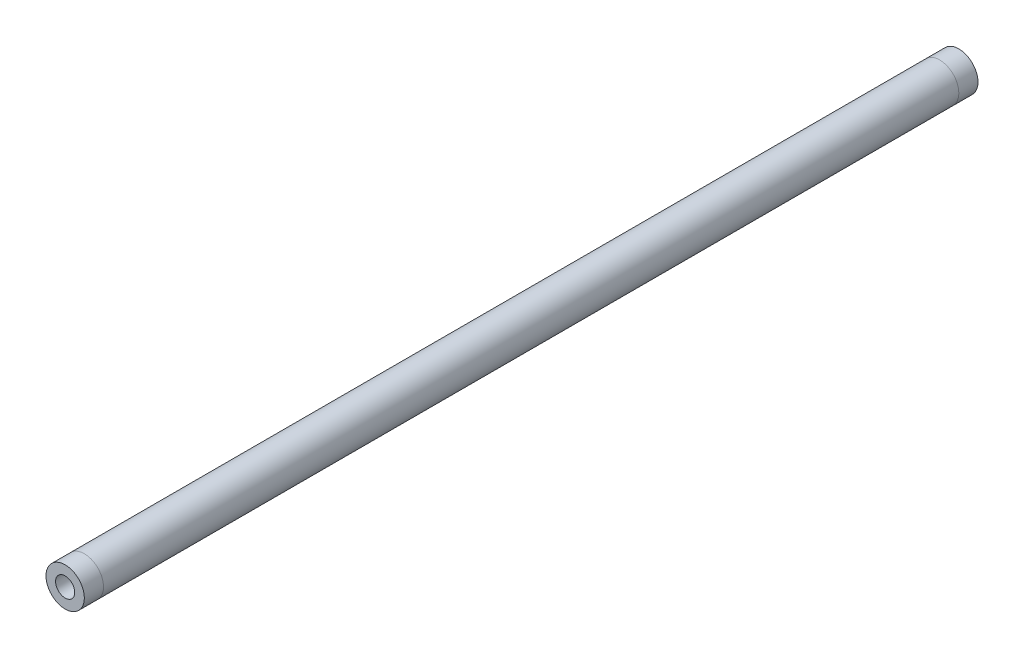
ISO-10303-21;
HEADER;
FILE_DESCRIPTION(('STEP AP214'),'2;1');
FILE_NAME('part.step','',(''),(''),'','','');
FILE_SCHEMA(('AUTOMOTIVE_DESIGN { 1 0 10303 214 1 1 1 1 }'));
ENDSEC;
DATA;
#1=APPLICATION_CONTEXT('core data for automotive mechanical design processes');
#2=APPLICATION_PROTOCOL_DEFINITION('international standard','automotive_design',2000,#1);
#3=PRODUCT_CONTEXT('',#1,'mechanical');
#4=PRODUCT('Part','Part','',(#3));
#5=PRODUCT_RELATED_PRODUCT_CATEGORY('part','',(#4));
#6=PRODUCT_DEFINITION_FORMATION('','',#4);
#7=PRODUCT_DEFINITION_CONTEXT('part definition',#1,'design');
#8=PRODUCT_DEFINITION('design','',#6,#7);
#9=PRODUCT_DEFINITION_SHAPE('','',#8);
#10=(LENGTH_UNIT() NAMED_UNIT(*) SI_UNIT(.MILLI.,.METRE.));
#11=(NAMED_UNIT(*) PLANE_ANGLE_UNIT() SI_UNIT($,.RADIAN.));
#12=(NAMED_UNIT(*) SI_UNIT($,.STERADIAN.) SOLID_ANGLE_UNIT());
#13=UNCERTAINTY_MEASURE_WITH_UNIT(LENGTH_MEASURE(1.E-05),#10,'distance_accuracy_value','');
#14=(GEOMETRIC_REPRESENTATION_CONTEXT(3) GLOBAL_UNCERTAINTY_ASSIGNED_CONTEXT((#13)) GLOBAL_UNIT_ASSIGNED_CONTEXT((#10,
#11,#12)) REPRESENTATION_CONTEXT('',''));
#15=CARTESIAN_POINT('',(0.,0.,0.));
#16=DIRECTION('',(0.,0.,1.));
#17=DIRECTION('',(1.,0.,0.));
#18=AXIS2_PLACEMENT_3D('',#15,#16,#17);
#19=CARTESIAN_POINT('',(0.,0.,-329.311578642138));
#20=DIRECTION('',(0.,0.,1.));
#21=DIRECTION('',(1.,0.,0.));
#22=AXIS2_PLACEMENT_3D('',#19,#20,#21);
#23=CYLINDRICAL_SURFACE('',#22,6.35);
#24=CARTESIAN_POINT('',(0.,0.,-311.3510664));
#25=DIRECTION('',(0.,0.,1.));
#26=DIRECTION('',(1.,0.,0.));
#27=AXIS2_PLACEMENT_3D('',#24,#25,#26);
#28=CIRCLE('',#27,6.35);
#29=CARTESIAN_POINT('',(6.35,0.,-311.3510664));
#30=VERTEX_POINT('',#29);
#31=EDGE_CURVE('E12',#30,#30,#28,.F.);
#32=ORIENTED_EDGE('',*,*,#31,.F.);
#33=EDGE_LOOP('',(#32));
#34=FACE_BOUND('',#33,.T.);
#35=CARTESIAN_POINT('',(0.,0.,-28.2575));
#36=DIRECTION('',(0.,0.,1.));
#37=DIRECTION('',(1.,0.,0.));
#38=AXIS2_PLACEMENT_3D('',#35,#36,#37);
#39=CIRCLE('',#38,6.35);
#40=CARTESIAN_POINT('',(6.35,0.,-28.2575));
#41=VERTEX_POINT('',#40);
#42=EDGE_CURVE('E81',#41,#41,#39,.T.);
#43=ORIENTED_EDGE('',*,*,#42,.F.);
#44=EDGE_LOOP('',(#43));
#45=FACE_BOUND('',#44,.T.);
#46=ADVANCED_FACE('F70',(#34,#45),#23,.T.);
#47=CARTESIAN_POINT('',(0.,0.,-28.2575));
#48=DIRECTION('',(0.,0.,1.));
#49=DIRECTION('',(1.,0.,0.));
#50=AXIS2_PLACEMENT_3D('',#47,#48,#49);
#51=PLANE('',#50);
#52=CARTESIAN_POINT('',(0.,0.,-28.2575));
#53=DIRECTION('',(0.,0.,1.));
#54=DIRECTION('',(1.,0.,0.));
#55=AXIS2_PLACEMENT_3D('',#52,#53,#54);
#56=CIRCLE('',#55,4.7625);
#57=CARTESIAN_POINT('',(4.7625,0.,-28.2575));
#58=VERTEX_POINT('',#57);
#59=EDGE_CURVE('E83',#58,#58,#56,.T.);
#60=ORIENTED_EDGE('',*,*,#59,.F.);
#61=EDGE_LOOP('',(#60));
#62=FACE_BOUND('',#61,.T.);
#63=ORIENTED_EDGE('',*,*,#42,.T.);
#64=EDGE_LOOP('',(#63));
#65=FACE_BOUND('',#64,.T.);
#66=ADVANCED_FACE('F88',(#62,#65),#51,.T.);
#67=CARTESIAN_POINT('',(0.,0.,-329.311578642138));
#68=DIRECTION('',(0.,0.,1.));
#69=DIRECTION('',(1.,0.,0.));
#70=AXIS2_PLACEMENT_3D('',#67,#68,#69);
#71=CYLINDRICAL_SURFACE('',#70,4.7625);
#72=CARTESIAN_POINT('',(0.,0.,-311.3510664));
#73=DIRECTION('',(0.,0.,1.));
#74=DIRECTION('',(1.,0.,0.));
#75=AXIS2_PLACEMENT_3D('',#72,#73,#74);
#76=CIRCLE('',#75,4.7625);
#77=CARTESIAN_POINT('',(4.7625,0.,-311.3510664));
#78=VERTEX_POINT('',#77);
#79=EDGE_CURVE('E73',#78,#78,#76,.F.);
#80=ORIENTED_EDGE('',*,*,#79,.T.);
#81=EDGE_LOOP('',(#80));
#82=FACE_BOUND('',#81,.T.);
#83=ORIENTED_EDGE('',*,*,#59,.T.);
#84=EDGE_LOOP('',(#83));
#85=FACE_BOUND('',#84,.T.);
#86=ADVANCED_FACE('F95',(#82,#85),#71,.F.);
#87=CARTESIAN_POINT('',(0.,0.,-311.3510664));
#88=DIRECTION('',(0.,0.,1.));
#89=DIRECTION('',(1.,0.,0.));
#90=AXIS2_PLACEMENT_3D('',#87,#88,#89);
#91=PLANE('',#90);
#92=ORIENTED_EDGE('',*,*,#31,.T.);
#93=EDGE_LOOP('',(#92));
#94=FACE_BOUND('',#93,.T.);
#95=ORIENTED_EDGE('',*,*,#79,.F.);
#96=EDGE_LOOP('',(#95));
#97=FACE_BOUND('',#96,.T.);
#98=ADVANCED_FACE('F100',(#94,#97),#91,.F.);
#99=CLOSED_SHELL('',(#46,#66,#86,#98));
#100=MANIFOLD_SOLID_BREP('B2',#99);
#101=CARTESIAN_POINT('',(0.,0.,-311.3510664));
#102=DIRECTION('',(0.,0.,1.));
#103=DIRECTION('',(1.,0.,0.));
#104=AXIS2_PLACEMENT_3D('',#101,#102,#103);
#105=PLANE('',#104);
#106=CARTESIAN_POINT('',(0.,0.,-311.3510664));
#107=DIRECTION('',(0.,0.,1.));
#108=DIRECTION('',(1.,0.,0.));
#109=AXIS2_PLACEMENT_3D('',#106,#107,#108);
#110=CIRCLE('',#109,6.35);
#111=CARTESIAN_POINT('',(6.35,0.,-311.3510664));
#112=VERTEX_POINT('',#111);
#113=EDGE_CURVE('E69',#112,#112,#110,.T.);
#114=ORIENTED_EDGE('',*,*,#113,.T.);
#115=EDGE_LOOP('',(#114));
#116=FACE_BOUND('',#115,.T.);
#117=CARTESIAN_POINT('',(0.,0.,-311.3510664));
#118=DIRECTION('',(0.,0.,1.));
#119=DIRECTION('',(1.,0.,0.));
#120=AXIS2_PLACEMENT_3D('',#117,#118,#119);
#121=CIRCLE('',#120,4.7625);
#122=CARTESIAN_POINT('',(4.7625,0.,-311.3510664));
#123=VERTEX_POINT('',#122);
#124=EDGE_CURVE('E153',#123,#123,#121,.T.);
#125=ORIENTED_EDGE('',*,*,#124,.F.);
#126=EDGE_LOOP('',(#125));
#127=FACE_BOUND('',#126,.T.);
#128=ADVANCED_FACE('F139',(#116,#127),#105,.T.);
#129=CARTESIAN_POINT('',(0.,0.,-311.3510664));
#130=DIRECTION('',(0.,0.,-1.));
#131=DIRECTION('',(-1.,0.,0.));
#132=AXIS2_PLACEMENT_3D('',#129,#130,#131);
#133=CYLINDRICAL_SURFACE('',#132,6.35);
#134=ORIENTED_EDGE('',*,*,#113,.F.);
#135=EDGE_LOOP('',(#134));
#136=FACE_BOUND('',#135,.T.);
#137=CARTESIAN_POINT('',(0.,0.,-317.7010664));
#138=DIRECTION('',(0.,0.,1.));
#139=DIRECTION('',(1.,0.,0.));
#140=AXIS2_PLACEMENT_3D('',#137,#138,#139);
#141=CIRCLE('',#140,6.35);
#142=CARTESIAN_POINT('',(6.35,0.,-317.7010664));
#143=VERTEX_POINT('',#142);
#144=EDGE_CURVE('E151',#143,#143,#141,.T.);
#145=ORIENTED_EDGE('',*,*,#144,.T.);
#146=EDGE_LOOP('',(#145));
#147=FACE_BOUND('',#146,.T.);
#148=ADVANCED_FACE('F141',(#136,#147),#133,.T.);
#149=CARTESIAN_POINT('',(0.,0.,-311.3510664));
#150=DIRECTION('',(0.,0.,-1.));
#151=DIRECTION('',(-1.,0.,0.));
#152=AXIS2_PLACEMENT_3D('',#149,#150,#151);
#153=CYLINDRICAL_SURFACE('',#152,3.175);
#154=CARTESIAN_POINT('',(0.,0.,-317.7010664));
#155=DIRECTION('',(0.,0.,1.));
#156=DIRECTION('',(1.,0.,0.));
#157=AXIS2_PLACEMENT_3D('',#154,#155,#156);
#158=CIRCLE('',#157,3.175);
#159=CARTESIAN_POINT('',(3.175,0.,-317.7010664));
#160=VERTEX_POINT('',#159);
#161=EDGE_CURVE('E143',#160,#160,#158,.T.);
#162=ORIENTED_EDGE('',*,*,#161,.F.);
#163=EDGE_LOOP('',(#162));
#164=FACE_BOUND('',#163,.T.);
#165=CARTESIAN_POINT('',(0.,0.,-305.0010664));
#166=DIRECTION('',(0.,0.,1.));
#167=DIRECTION('',(1.,0.,0.));
#168=AXIS2_PLACEMENT_3D('',#165,#166,#167);
#169=CIRCLE('',#168,3.175);
#170=CARTESIAN_POINT('',(3.175,0.,-305.0010664));
#171=VERTEX_POINT('',#170);
#172=EDGE_CURVE('E163',#171,#171,#169,.T.);
#173=ORIENTED_EDGE('',*,*,#172,.T.);
#174=EDGE_LOOP('',(#173));
#175=FACE_BOUND('',#174,.T.);
#176=ADVANCED_FACE('F168',(#164,#175),#153,.F.);
#177=CARTESIAN_POINT('',(0.,0.,-317.7010664));
#178=DIRECTION('',(0.,0.,1.));
#179=DIRECTION('',(1.,0.,0.));
#180=AXIS2_PLACEMENT_3D('',#177,#178,#179);
#181=PLANE('',#180);
#182=ORIENTED_EDGE('',*,*,#144,.F.);
#183=EDGE_LOOP('',(#182));
#184=FACE_BOUND('',#183,.T.);
#185=ORIENTED_EDGE('',*,*,#161,.T.);
#186=EDGE_LOOP('',(#185));
#187=FACE_BOUND('',#186,.T.);
#188=ADVANCED_FACE('F173',(#184,#187),#181,.F.);
#189=CARTESIAN_POINT('',(0.,0.,-305.0010664));
#190=DIRECTION('',(0.,0.,1.));
#191=DIRECTION('',(1.,0.,0.));
#192=AXIS2_PLACEMENT_3D('',#189,#190,#191);
#193=PLANE('',#192);
#194=CARTESIAN_POINT('',(0.,0.,-305.0010664));
#195=DIRECTION('',(0.,0.,1.));
#196=DIRECTION('',(1.,0.,0.));
#197=AXIS2_PLACEMENT_3D('',#194,#195,#196);
#198=CIRCLE('',#197,4.7625);
#199=CARTESIAN_POINT('',(4.7625,0.,-305.0010664));
#200=VERTEX_POINT('',#199);
#201=EDGE_CURVE('E156',#200,#200,#198,.T.);
#202=ORIENTED_EDGE('',*,*,#201,.T.);
#203=EDGE_LOOP('',(#202));
#204=FACE_BOUND('',#203,.T.);
#205=ORIENTED_EDGE('',*,*,#172,.F.);
#206=EDGE_LOOP('',(#205));
#207=FACE_BOUND('',#206,.T.);
#208=ADVANCED_FACE('F170',(#204,#207),#193,.T.);
#209=CARTESIAN_POINT('',(0.,0.,-305.0010664));
#210=DIRECTION('',(0.,0.,-1.));
#211=DIRECTION('',(-1.,0.,0.));
#212=AXIS2_PLACEMENT_3D('',#209,#210,#211);
#213=CYLINDRICAL_SURFACE('',#212,4.7625);
#214=ORIENTED_EDGE('',*,*,#201,.F.);
#215=EDGE_LOOP('',(#214));
#216=FACE_BOUND('',#215,.T.);
#217=ORIENTED_EDGE('',*,*,#124,.T.);
#218=EDGE_LOOP('',(#217));
#219=FACE_BOUND('',#218,.T.);
#220=ADVANCED_FACE('F172',(#216,#219),#213,.T.);
#221=CLOSED_SHELL('',(#128,#148,#176,#188,#208,#220));
#222=MANIFOLD_SOLID_BREP('B7',#221);
#223=CARTESIAN_POINT('',(0.,0.,-28.2575));
#224=DIRECTION('',(0.,0.,1.));
#225=DIRECTION('',(1.,0.,0.));
#226=AXIS2_PLACEMENT_3D('',#223,#224,#225);
#227=CYLINDRICAL_SURFACE('',#226,6.35);
#228=CARTESIAN_POINT('',(0.,0.,-28.2575));
#229=DIRECTION('',(0.,0.,1.));
#230=DIRECTION('',(1.,0.,0.));
#231=AXIS2_PLACEMENT_3D('',#228,#229,#230);
#232=CIRCLE('',#231,6.35);
#233=CARTESIAN_POINT('',(6.35,0.,-28.2575));
#234=VERTEX_POINT('',#233);
#235=EDGE_CURVE('E138',#234,#234,#232,.T.);
#236=ORIENTED_EDGE('',*,*,#235,.T.);
#237=EDGE_LOOP('',(#236));
#238=FACE_BOUND('',#237,.T.);
#239=CARTESIAN_POINT('',(0.,0.,-21.9075));
#240=DIRECTION('',(0.,0.,1.));
#241=DIRECTION('',(1.,0.,0.));
#242=AXIS2_PLACEMENT_3D('',#239,#240,#241);
#243=CIRCLE('',#242,6.35);
#244=CARTESIAN_POINT('',(6.35,0.,-21.9075));
#245=VERTEX_POINT('',#244);
#246=EDGE_CURVE('E251',#245,#245,#243,.T.);
#247=ORIENTED_EDGE('',*,*,#246,.F.);
#248=EDGE_LOOP('',(#247));
#249=FACE_BOUND('',#248,.T.);
#250=ADVANCED_FACE('F240',(#238,#249),#227,.T.);
#251=CARTESIAN_POINT('',(0.,0.,-28.2575));
#252=DIRECTION('',(0.,0.,1.));
#253=DIRECTION('',(1.,0.,0.));
#254=AXIS2_PLACEMENT_3D('',#251,#252,#253);
#255=CYLINDRICAL_SURFACE('',#254,3.175);
#256=CARTESIAN_POINT('',(0.,0.,-21.9075));
#257=DIRECTION('',(0.,0.,1.));
#258=DIRECTION('',(1.,0.,0.));
#259=AXIS2_PLACEMENT_3D('',#256,#257,#258);
#260=CIRCLE('',#259,3.175);
#261=CARTESIAN_POINT('',(3.175,0.,-21.9075));
#262=VERTEX_POINT('',#261);
#263=EDGE_CURVE('E243',#262,#262,#260,.T.);
#264=ORIENTED_EDGE('',*,*,#263,.T.);
#265=EDGE_LOOP('',(#264));
#266=FACE_BOUND('',#265,.T.);
#267=CARTESIAN_POINT('',(0.,0.,-34.6075));
#268=DIRECTION('',(0.,0.,1.));
#269=DIRECTION('',(1.,0.,0.));
#270=AXIS2_PLACEMENT_3D('',#267,#268,#269);
#271=CIRCLE('',#270,3.175);
#272=CARTESIAN_POINT('',(3.175,0.,-34.6075));
#273=VERTEX_POINT('',#272);
#274=EDGE_CURVE('E263',#273,#273,#271,.T.);
#275=ORIENTED_EDGE('',*,*,#274,.F.);
#276=EDGE_LOOP('',(#275));
#277=FACE_BOUND('',#276,.T.);
#278=ADVANCED_FACE('F271',(#266,#277),#255,.F.);
#279=CARTESIAN_POINT('',(0.,0.,-28.2575));
#280=DIRECTION('',(0.,0.,1.));
#281=DIRECTION('',(1.,0.,0.));
#282=AXIS2_PLACEMENT_3D('',#279,#280,#281);
#283=PLANE('',#282);
#284=CARTESIAN_POINT('',(0.,0.,-28.2575));
#285=DIRECTION('',(0.,0.,1.));
#286=DIRECTION('',(1.,0.,0.));
#287=AXIS2_PLACEMENT_3D('',#284,#285,#286);
#288=CIRCLE('',#287,4.7625);
#289=CARTESIAN_POINT('',(4.7625,0.,-28.2575));
#290=VERTEX_POINT('',#289);
#291=EDGE_CURVE('E253',#290,#290,#288,.T.);
#292=ORIENTED_EDGE('',*,*,#291,.T.);
#293=EDGE_LOOP('',(#292));
#294=FACE_BOUND('',#293,.T.);
#295=ORIENTED_EDGE('',*,*,#235,.F.);
#296=EDGE_LOOP('',(#295));
#297=FACE_BOUND('',#296,.T.);
#298=ADVANCED_FACE('F273',(#294,#297),#283,.F.);
#299=CARTESIAN_POINT('',(0.,0.,-21.9075));
#300=DIRECTION('',(0.,0.,1.));
#301=DIRECTION('',(1.,0.,0.));
#302=AXIS2_PLACEMENT_3D('',#299,#300,#301);
#303=PLANE('',#302);
#304=ORIENTED_EDGE('',*,*,#246,.T.);
#305=EDGE_LOOP('',(#304));
#306=FACE_BOUND('',#305,.T.);
#307=ORIENTED_EDGE('',*,*,#263,.F.);
#308=EDGE_LOOP('',(#307));
#309=FACE_BOUND('',#308,.T.);
#310=ADVANCED_FACE('F279',(#306,#309),#303,.T.);
#311=CARTESIAN_POINT('',(0.,0.,-34.6075));
#312=DIRECTION('',(0.,0.,1.));
#313=DIRECTION('',(1.,0.,0.));
#314=AXIS2_PLACEMENT_3D('',#311,#312,#313);
#315=CYLINDRICAL_SURFACE('',#314,4.7625);
#316=CARTESIAN_POINT('',(0.,0.,-34.6075));
#317=DIRECTION('',(0.,0.,1.));
#318=DIRECTION('',(1.,0.,0.));
#319=AXIS2_PLACEMENT_3D('',#316,#317,#318);
#320=CIRCLE('',#319,4.7625);
#321=CARTESIAN_POINT('',(4.7625,0.,-34.6075));
#322=VERTEX_POINT('',#321);
#323=EDGE_CURVE('E256',#322,#322,#320,.T.);
#324=ORIENTED_EDGE('',*,*,#323,.T.);
#325=EDGE_LOOP('',(#324));
#326=FACE_BOUND('',#325,.T.);
#327=ORIENTED_EDGE('',*,*,#291,.F.);
#328=EDGE_LOOP('',(#327));
#329=FACE_BOUND('',#328,.T.);
#330=ADVANCED_FACE('F284',(#326,#329),#315,.T.);
#331=CARTESIAN_POINT('',(0.,0.,-34.6075));
#332=DIRECTION('',(0.,0.,1.));
#333=DIRECTION('',(1.,0.,0.));
#334=AXIS2_PLACEMENT_3D('',#331,#332,#333);
#335=PLANE('',#334);
#336=ORIENTED_EDGE('',*,*,#274,.T.);
#337=EDGE_LOOP('',(#336));
#338=FACE_BOUND('',#337,.T.);
#339=ORIENTED_EDGE('',*,*,#323,.F.);
#340=EDGE_LOOP('',(#339));
#341=FACE_BOUND('',#340,.T.);
#342=ADVANCED_FACE('F268',(#338,#341),#335,.F.);
#343=CLOSED_SHELL('',(#250,#278,#298,#310,#330,#342));
#344=MANIFOLD_SOLID_BREP('B64',#343);
#345=ADVANCED_BREP_SHAPE_REPRESENTATION('',(#18,#100,#222,#344),#14);
#346=SHAPE_DEFINITION_REPRESENTATION(#9,#345);
ENDSEC;
END-ISO-10303-21;
